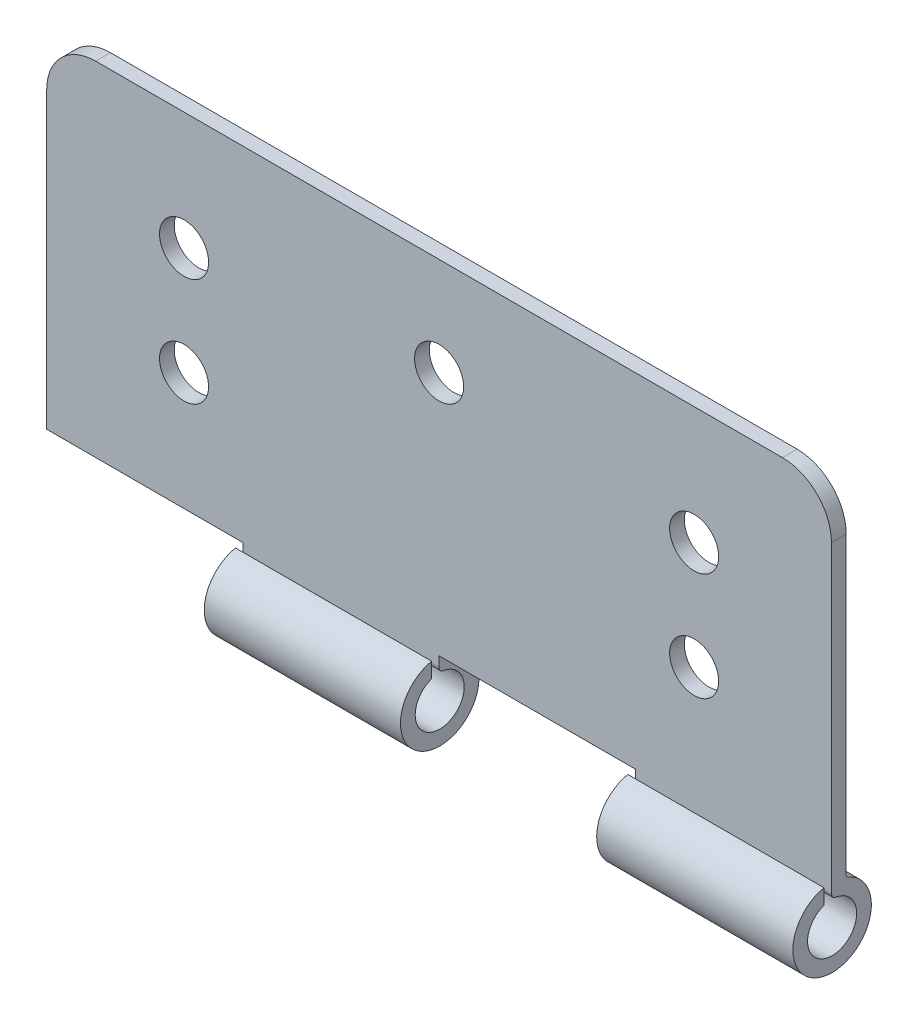
ISO-10303-21;
HEADER;
FILE_DESCRIPTION(('STEP AP214'),'2;1');
FILE_NAME('part.step','',(''),(''),'','','');
FILE_SCHEMA(('AUTOMOTIVE_DESIGN { 1 0 10303 214 1 1 1 1 }'));
ENDSEC;
DATA;
#1=APPLICATION_CONTEXT('core data for automotive mechanical design processes');
#2=APPLICATION_PROTOCOL_DEFINITION('international standard','automotive_design',2000,#1);
#3=PRODUCT_CONTEXT('',#1,'mechanical');
#4=PRODUCT('Part','Part','',(#3));
#5=PRODUCT_RELATED_PRODUCT_CATEGORY('part','',(#4));
#6=PRODUCT_DEFINITION_FORMATION('','',#4);
#7=PRODUCT_DEFINITION_CONTEXT('part definition',#1,'design');
#8=PRODUCT_DEFINITION('design','',#6,#7);
#9=PRODUCT_DEFINITION_SHAPE('','',#8);
#10=(LENGTH_UNIT() NAMED_UNIT(*) SI_UNIT(.MILLI.,.METRE.));
#11=(NAMED_UNIT(*) PLANE_ANGLE_UNIT() SI_UNIT($,.RADIAN.));
#12=(NAMED_UNIT(*) SI_UNIT($,.STERADIAN.) SOLID_ANGLE_UNIT());
#13=UNCERTAINTY_MEASURE_WITH_UNIT(LENGTH_MEASURE(1.E-05),#10,'distance_accuracy_value','');
#14=(GEOMETRIC_REPRESENTATION_CONTEXT(3) GLOBAL_UNCERTAINTY_ASSIGNED_CONTEXT((#13)) GLOBAL_UNIT_ASSIGNED_CONTEXT((#10,
#11,#12)) REPRESENTATION_CONTEXT('',''));
#15=CARTESIAN_POINT('',(0.,0.,0.));
#16=DIRECTION('',(0.,0.,1.));
#17=DIRECTION('',(1.,0.,0.));
#18=AXIS2_PLACEMENT_3D('',#15,#16,#17);
#19=CARTESIAN_POINT('',(40.,-17.5,1.5));
#20=DIRECTION('',(0.,1.,0.));
#21=DIRECTION('',(-1.,0.,0.));
#22=AXIS2_PLACEMENT_3D('',#19,#20,#21);
#23=PLANE('',#22);
#24=DIRECTION('',(0.,0.,1.));
#25=VECTOR('',#24,1.);
#26=CARTESIAN_POINT('',(-20.,-17.5,0.));
#27=LINE('',#26,#25);
#28=CARTESIAN_POINT('',(-20.,-17.5,0.));
#29=VERTEX_POINT('',#28);
#30=CARTESIAN_POINT('',(-20.,-17.5,1.5));
#31=VERTEX_POINT('',#30);
#32=EDGE_CURVE('E58',#29,#31,#27,.T.);
#33=ORIENTED_EDGE('',*,*,#32,.T.);
#34=DIRECTION('',(1.,0.,0.));
#35=VECTOR('',#34,1.);
#36=CARTESIAN_POINT('',(40.,-17.5,1.5));
#37=LINE('',#36,#35);
#38=CARTESIAN_POINT('',(-40.,-17.5,1.5));
#39=VERTEX_POINT('',#38);
#40=EDGE_CURVE('E311',#39,#31,#37,.T.);
#41=ORIENTED_EDGE('',*,*,#40,.F.);
#42=DIRECTION('',(0.,0.,-1.));
#43=VECTOR('',#42,1.);
#44=CARTESIAN_POINT('',(-40.,-17.5,1.5));
#45=LINE('',#44,#43);
#46=CARTESIAN_POINT('',(-40.,-17.5,0.));
#47=VERTEX_POINT('',#46);
#48=EDGE_CURVE('E313',#39,#47,#45,.T.);
#49=ORIENTED_EDGE('',*,*,#48,.T.);
#50=DIRECTION('',(1.,0.,0.));
#51=VECTOR('',#50,1.);
#52=CARTESIAN_POINT('',(40.,-17.5,0.));
#53=LINE('',#52,#51);
#54=EDGE_CURVE('E303',#47,#29,#53,.T.);
#55=ORIENTED_EDGE('',*,*,#54,.T.);
#56=EDGE_LOOP('',(#33,#41,#49,#55));
#57=FACE_BOUND('',#56,.T.);
#58=ADVANCED_FACE('F33',(#57),#23,.F.);
#59=CARTESIAN_POINT('',(40.,-17.5,1.5));
#60=DIRECTION('',(-1.,0.,0.));
#61=DIRECTION('',(0.,0.,1.));
#62=AXIS2_PLACEMENT_3D('',#59,#60,#61);
#63=PLANE('',#62);
#64=DIRECTION('',(0.,1.,0.));
#65=VECTOR('',#64,1.);
#66=CARTESIAN_POINT('',(40.,-17.5,0.));
#67=LINE('',#66,#65);
#68=CARTESIAN_POINT('',(40.,-17.5989471089014,0.));
#69=VERTEX_POINT('',#68);
#70=CARTESIAN_POINT('',(40.,12.5,0.));
#71=VERTEX_POINT('',#70);
#72=EDGE_CURVE('E288',#69,#71,#67,.T.);
#73=ORIENTED_EDGE('',*,*,#72,.T.);
#74=DIRECTION('',(0.,0.,-1.));
#75=VECTOR('',#74,1.);
#76=CARTESIAN_POINT('',(40.,12.5,1.5));
#77=LINE('',#76,#75);
#78=CARTESIAN_POINT('',(40.,12.5,1.5));
#79=VERTEX_POINT('',#78);
#80=EDGE_CURVE('E11',#79,#71,#77,.T.);
#81=ORIENTED_EDGE('',*,*,#80,.F.);
#82=DIRECTION('',(0.,1.,0.));
#83=VECTOR('',#82,1.);
#84=CARTESIAN_POINT('',(40.,-17.5,1.5));
#85=LINE('',#84,#83);
#86=CARTESIAN_POINT('',(40.,-18.5316046724608,1.5));
#87=VERTEX_POINT('',#86);
#88=EDGE_CURVE('E299',#87,#79,#85,.T.);
#89=ORIENTED_EDGE('',*,*,#88,.F.);
#90=CARTESIAN_POINT('',(40.,-18.5316046724608,1.));
#91=DIRECTION('',(1.,0.,0.));
#92=DIRECTION('',(0.,0.,-1.));
#93=AXIS2_PLACEMENT_3D('',#90,#91,#92);
#94=CIRCLE('',#93,0.5);
#95=CARTESIAN_POINT('',(40.,-19.0262561690371,1.07293762358944));
#96=VERTEX_POINT('',#95);
#97=EDGE_CURVE('E239',#87,#96,#94,.T.);
#98=ORIENTED_EDGE('',*,*,#97,.T.);
#99=CARTESIAN_POINT('',(40.,-21.4995136519183,1.43762574153661));
#100=DIRECTION('',(-1.,0.,0.));
#101=DIRECTION('',(0.,0.,-1.));
#102=AXIS2_PLACEMENT_3D('',#99,#100,#101);
#103=CIRCLE('',#102,2.5);
#104=CARTESIAN_POINT('',(40.,-19.1403349739834,2.2648354885641));
#105=VERTEX_POINT('',#104);
#106=EDGE_CURVE('E274',#96,#105,#103,.T.);
#107=ORIENTED_EDGE('',*,*,#106,.T.);
#108=DIRECTION('',(0.,1.,0.));
#109=VECTOR('',#108,1.);
#110=CARTESIAN_POINT('',(40.,-17.585982760968,2.2648354885641));
#111=LINE('',#110,#109);
#112=CARTESIAN_POINT('',(40.,-17.585982760968,2.2648354885641));
#113=VERTEX_POINT('',#112);
#114=EDGE_CURVE('E277',#105,#113,#111,.T.);
#115=ORIENTED_EDGE('',*,*,#114,.T.);
#116=CARTESIAN_POINT('',(40.,-21.4995136519183,1.43762574153661));
#117=DIRECTION('',(1.,0.,0.));
#118=DIRECTION('',(0.,0.,-1.));
#119=AXIS2_PLACEMENT_3D('',#116,#117,#118);
#120=CIRCLE('',#119,4.);
#121=CARTESIAN_POINT('',(40.,-17.8283921996671,-0.15072789755667));
#122=VERTEX_POINT('',#121);
#123=EDGE_CURVE('E280',#113,#122,#120,.T.);
#124=ORIENTED_EDGE('',*,*,#123,.T.);
#125=CARTESIAN_POINT('',(40.,-17.5989471089014,-0.25));
#126=DIRECTION('',(-1.,0.,0.));
#127=DIRECTION('',(0.,0.,-1.));
#128=AXIS2_PLACEMENT_3D('',#125,#126,#127);
#129=CIRCLE('',#128,0.25);
#130=EDGE_CURVE('E251',#122,#69,#129,.T.);
#131=ORIENTED_EDGE('',*,*,#130,.T.);
#132=EDGE_LOOP('',(#73,#81,#89,#98,#107,#115,#124,#131));
#133=FACE_BOUND('',#132,.T.);
#134=ADVANCED_FACE('F35',(#133),#63,.F.);
#135=CARTESIAN_POINT('',(35.,12.5,1.5));
#136=DIRECTION('',(0.,0.,-1.));
#137=DIRECTION('',(-1.,0.,0.));
#138=AXIS2_PLACEMENT_3D('',#135,#136,#137);
#139=CYLINDRICAL_SURFACE('',#138,5.);
#140=CARTESIAN_POINT('',(35.,12.5,0.));
#141=DIRECTION('',(0.,0.,1.));
#142=DIRECTION('',(1.,0.,0.));
#143=AXIS2_PLACEMENT_3D('',#140,#141,#142);
#144=CIRCLE('',#143,5.);
#145=CARTESIAN_POINT('',(35.,17.5,0.));
#146=VERTEX_POINT('',#145);
#147=EDGE_CURVE('E316',#71,#146,#144,.T.);
#148=ORIENTED_EDGE('',*,*,#147,.T.);
#149=DIRECTION('',(0.,0.,-1.));
#150=VECTOR('',#149,1.);
#151=CARTESIAN_POINT('',(35.,17.5,1.5));
#152=LINE('',#151,#150);
#153=CARTESIAN_POINT('',(35.,17.5,1.5));
#154=VERTEX_POINT('',#153);
#155=EDGE_CURVE('E42',#154,#146,#152,.T.);
#156=ORIENTED_EDGE('',*,*,#155,.F.);
#157=CARTESIAN_POINT('',(35.,12.5,1.5));
#158=DIRECTION('',(0.,0.,1.));
#159=DIRECTION('',(1.,0.,0.));
#160=AXIS2_PLACEMENT_3D('',#157,#158,#159);
#161=CIRCLE('',#160,5.);
#162=EDGE_CURVE('E302',#79,#154,#161,.T.);
#163=ORIENTED_EDGE('',*,*,#162,.F.);
#164=ORIENTED_EDGE('',*,*,#80,.T.);
#165=EDGE_LOOP('',(#148,#156,#163,#164));
#166=FACE_BOUND('',#165,.T.);
#167=ADVANCED_FACE('F382',(#166),#139,.T.);
#168=CARTESIAN_POINT('',(35.,17.5,1.5));
#169=DIRECTION('',(0.,-1.,0.));
#170=DIRECTION('',(1.,0.,0.));
#171=AXIS2_PLACEMENT_3D('',#168,#169,#170);
#172=PLANE('',#171);
#173=DIRECTION('',(-1.,0.,0.));
#174=VECTOR('',#173,1.);
#175=CARTESIAN_POINT('',(35.,17.5,0.));
#176=LINE('',#175,#174);
#177=CARTESIAN_POINT('',(-35.,17.5,0.));
#178=VERTEX_POINT('',#177);
#179=EDGE_CURVE('E318',#146,#178,#176,.T.);
#180=ORIENTED_EDGE('',*,*,#179,.T.);
#181=DIRECTION('',(0.,0.,-1.));
#182=VECTOR('',#181,1.);
#183=CARTESIAN_POINT('',(-35.,17.5,1.5));
#184=LINE('',#183,#182);
#185=CARTESIAN_POINT('',(-35.,17.5,1.5));
#186=VERTEX_POINT('',#185);
#187=EDGE_CURVE('E331',#186,#178,#184,.T.);
#188=ORIENTED_EDGE('',*,*,#187,.F.);
#189=DIRECTION('',(-1.,0.,0.));
#190=VECTOR('',#189,1.);
#191=CARTESIAN_POINT('',(35.,17.5,1.5));
#192=LINE('',#191,#190);
#193=EDGE_CURVE('E305',#154,#186,#192,.T.);
#194=ORIENTED_EDGE('',*,*,#193,.F.);
#195=ORIENTED_EDGE('',*,*,#155,.T.);
#196=EDGE_LOOP('',(#180,#188,#194,#195));
#197=FACE_BOUND('',#196,.T.);
#198=ADVANCED_FACE('F387',(#197),#172,.F.);
#199=CARTESIAN_POINT('',(-35.,12.5,1.5));
#200=DIRECTION('',(0.,0.,-1.));
#201=DIRECTION('',(-1.,0.,0.));
#202=AXIS2_PLACEMENT_3D('',#199,#200,#201);
#203=CYLINDRICAL_SURFACE('',#202,5.);
#204=CARTESIAN_POINT('',(-35.,12.5,0.));
#205=DIRECTION('',(0.,0.,1.));
#206=DIRECTION('',(1.,0.,0.));
#207=AXIS2_PLACEMENT_3D('',#204,#205,#206);
#208=CIRCLE('',#207,5.);
#209=CARTESIAN_POINT('',(-40.,12.5,0.));
#210=VERTEX_POINT('',#209);
#211=EDGE_CURVE('E320',#178,#210,#208,.T.);
#212=ORIENTED_EDGE('',*,*,#211,.T.);
#213=DIRECTION('',(0.,0.,-1.));
#214=VECTOR('',#213,1.);
#215=CARTESIAN_POINT('',(-40.,12.5,1.5));
#216=LINE('',#215,#214);
#217=CARTESIAN_POINT('',(-40.,12.5,1.5));
#218=VERTEX_POINT('',#217);
#219=EDGE_CURVE('E328',#218,#210,#216,.T.);
#220=ORIENTED_EDGE('',*,*,#219,.F.);
#221=CARTESIAN_POINT('',(-35.,12.5,1.5));
#222=DIRECTION('',(0.,0.,1.));
#223=DIRECTION('',(1.,0.,0.));
#224=AXIS2_PLACEMENT_3D('',#221,#222,#223);
#225=CIRCLE('',#224,5.);
#226=EDGE_CURVE('E307',#186,#218,#225,.T.);
#227=ORIENTED_EDGE('',*,*,#226,.F.);
#228=ORIENTED_EDGE('',*,*,#187,.T.);
#229=EDGE_LOOP('',(#212,#220,#227,#228));
#230=FACE_BOUND('',#229,.T.);
#231=ADVANCED_FACE('F393',(#230),#203,.T.);
#232=CARTESIAN_POINT('',(-40.,-17.5,1.5));
#233=DIRECTION('',(1.,0.,0.));
#234=DIRECTION('',(0.,0.,-1.));
#235=AXIS2_PLACEMENT_3D('',#232,#233,#234);
#236=PLANE('',#235);
#237=DIRECTION('',(0.,-1.,0.));
#238=VECTOR('',#237,1.);
#239=CARTESIAN_POINT('',(-40.,-17.5,0.));
#240=LINE('',#239,#238);
#241=EDGE_CURVE('E322',#210,#47,#240,.T.);
#242=ORIENTED_EDGE('',*,*,#241,.T.);
#243=ORIENTED_EDGE('',*,*,#48,.F.);
#244=DIRECTION('',(0.,-1.,0.));
#245=VECTOR('',#244,1.);
#246=CARTESIAN_POINT('',(-40.,-17.5,1.5));
#247=LINE('',#246,#245);
#248=EDGE_CURVE('E309',#218,#39,#247,.T.);
#249=ORIENTED_EDGE('',*,*,#248,.F.);
#250=ORIENTED_EDGE('',*,*,#219,.T.);
#251=EDGE_LOOP('',(#242,#243,#249,#250));
#252=FACE_BOUND('',#251,.T.);
#253=ADVANCED_FACE('F397',(#252),#236,.F.);
#254=CARTESIAN_POINT('',(0.,-17.5,1.5));
#255=VERTEX_POINT('',#254);
#256=CARTESIAN_POINT('',(20.,-17.5,1.5));
#257=VERTEX_POINT('',#256);
#258=EDGE_CURVE('E50',#255,#257,#37,.T.);
#259=ORIENTED_EDGE('',*,*,#258,.F.);
#260=DIRECTION('',(0.,0.,1.));
#261=VECTOR('',#260,1.);
#262=CARTESIAN_POINT('',(0.,-17.5,0.));
#263=LINE('',#262,#261);
#264=CARTESIAN_POINT('',(0.,-17.5,0.));
#265=VERTEX_POINT('',#264);
#266=EDGE_CURVE('E203',#265,#255,#263,.T.);
#267=ORIENTED_EDGE('',*,*,#266,.F.);
#268=CARTESIAN_POINT('',(20.,-17.5,0.));
#269=VERTEX_POINT('',#268);
#270=EDGE_CURVE('E324',#265,#269,#53,.T.);
#271=ORIENTED_EDGE('',*,*,#270,.T.);
#272=DIRECTION('',(0.,0.,1.));
#273=VECTOR('',#272,1.);
#274=CARTESIAN_POINT('',(20.,-17.5,0.));
#275=LINE('',#274,#273);
#276=EDGE_CURVE('E266',#269,#257,#275,.T.);
#277=ORIENTED_EDGE('',*,*,#276,.T.);
#278=EDGE_LOOP('',(#259,#267,#271,#277));
#279=FACE_BOUND('',#278,.T.);
#280=ADVANCED_FACE('F369',(#279),#23,.F.);
#281=CARTESIAN_POINT('',(35.,12.5,1.5));
#282=DIRECTION('',(0.,0.,1.));
#283=DIRECTION('',(1.,0.,0.));
#284=AXIS2_PLACEMENT_3D('',#281,#282,#283);
#285=PLANE('',#284);
#286=CARTESIAN_POINT('',(26.,5.5,1.5));
#287=DIRECTION('',(0.,0.,1.));
#288=DIRECTION('',(1.,0.,0.));
#289=AXIS2_PLACEMENT_3D('',#286,#287,#288);
#290=CIRCLE('',#289,2.5);
#291=CARTESIAN_POINT('',(28.5,5.5,1.5));
#292=VERTEX_POINT('',#291);
#293=EDGE_CURVE('E356',#292,#292,#290,.T.);
#294=ORIENTED_EDGE('',*,*,#293,.F.);
#295=EDGE_LOOP('',(#294));
#296=FACE_BOUND('',#295,.T.);
#297=CARTESIAN_POINT('',(-26.,5.5,1.5));
#298=DIRECTION('',(0.,0.,1.));
#299=DIRECTION('',(1.,0.,0.));
#300=AXIS2_PLACEMENT_3D('',#297,#298,#299);
#301=CIRCLE('',#300,2.5);
#302=CARTESIAN_POINT('',(-23.5,5.5,1.5));
#303=VERTEX_POINT('',#302);
#304=EDGE_CURVE('E347',#303,#303,#301,.T.);
#305=ORIENTED_EDGE('',*,*,#304,.F.);
#306=EDGE_LOOP('',(#305));
#307=FACE_BOUND('',#306,.T.);
#308=CARTESIAN_POINT('',(-26.,-5.50000000000002,1.5));
#309=DIRECTION('',(0.,0.,1.));
#310=DIRECTION('',(1.,0.,0.));
#311=AXIS2_PLACEMENT_3D('',#308,#309,#310);
#312=CIRCLE('',#311,2.5);
#313=CARTESIAN_POINT('',(-23.5,-5.50000000000002,1.5));
#314=VERTEX_POINT('',#313);
#315=EDGE_CURVE('E342',#314,#314,#312,.T.);
#316=ORIENTED_EDGE('',*,*,#315,.F.);
#317=EDGE_LOOP('',(#316));
#318=FACE_BOUND('',#317,.T.);
#319=CARTESIAN_POINT('',(26.,-5.50000000000001,1.5));
#320=DIRECTION('',(0.,0.,1.));
#321=DIRECTION('',(1.,0.,0.));
#322=AXIS2_PLACEMENT_3D('',#319,#320,#321);
#323=CIRCLE('',#322,2.5);
#324=CARTESIAN_POINT('',(28.5,-5.50000000000001,1.5));
#325=VERTEX_POINT('',#324);
#326=EDGE_CURVE('E346',#325,#325,#323,.T.);
#327=ORIENTED_EDGE('',*,*,#326,.F.);
#328=EDGE_LOOP('',(#327));
#329=FACE_BOUND('',#328,.T.);
#330=CARTESIAN_POINT('',(0.,7.5,1.5));
#331=DIRECTION('',(0.,0.,1.));
#332=DIRECTION('',(1.,0.,0.));
#333=AXIS2_PLACEMENT_3D('',#330,#331,#332);
#334=CIRCLE('',#333,2.5);
#335=CARTESIAN_POINT('',(2.5,7.5,1.5));
#336=VERTEX_POINT('',#335);
#337=EDGE_CURVE('E206',#336,#336,#334,.T.);
#338=ORIENTED_EDGE('',*,*,#337,.F.);
#339=EDGE_LOOP('',(#338));
#340=FACE_BOUND('',#339,.T.);
#341=ORIENTED_EDGE('',*,*,#88,.T.);
#342=ORIENTED_EDGE('',*,*,#162,.T.);
#343=ORIENTED_EDGE('',*,*,#193,.T.);
#344=ORIENTED_EDGE('',*,*,#226,.T.);
#345=ORIENTED_EDGE('',*,*,#248,.T.);
#346=ORIENTED_EDGE('',*,*,#40,.T.);
#347=DIRECTION('',(0.,-1.,0.));
#348=VECTOR('',#347,1.);
#349=CARTESIAN_POINT('',(-20.,-17.5,1.5));
#350=LINE('',#349,#348);
#351=CARTESIAN_POINT('',(-20.,-18.5316046724608,1.5));
#352=VERTEX_POINT('',#351);
#353=EDGE_CURVE('E185',#31,#352,#350,.T.);
#354=ORIENTED_EDGE('',*,*,#353,.T.);
#355=DIRECTION('',(1.,0.,0.));
#356=VECTOR('',#355,1.);
#357=CARTESIAN_POINT('',(-20.,-18.5316046724608,1.5));
#358=LINE('',#357,#356);
#359=CARTESIAN_POINT('',(0.,-18.5316046724608,1.5));
#360=VERTEX_POINT('',#359);
#361=EDGE_CURVE('E199',#352,#360,#358,.T.);
#362=ORIENTED_EDGE('',*,*,#361,.T.);
#363=DIRECTION('',(0.,-1.,0.));
#364=VECTOR('',#363,1.);
#365=CARTESIAN_POINT('',(0.,-17.5,1.5));
#366=LINE('',#365,#364);
#367=EDGE_CURVE('E200',#255,#360,#366,.T.);
#368=ORIENTED_EDGE('',*,*,#367,.F.);
#369=ORIENTED_EDGE('',*,*,#258,.T.);
#370=DIRECTION('',(0.,-1.,0.));
#371=VECTOR('',#370,1.);
#372=CARTESIAN_POINT('',(20.,-17.5,1.5));
#373=LINE('',#372,#371);
#374=CARTESIAN_POINT('',(20.,-18.5316046724608,1.5));
#375=VERTEX_POINT('',#374);
#376=EDGE_CURVE('E268',#257,#375,#373,.T.);
#377=ORIENTED_EDGE('',*,*,#376,.T.);
#378=DIRECTION('',(1.,0.,0.));
#379=VECTOR('',#378,1.);
#380=CARTESIAN_POINT('',(20.,-18.5316046724608,1.5));
#381=LINE('',#380,#379);
#382=EDGE_CURVE('E285',#375,#87,#381,.T.);
#383=ORIENTED_EDGE('',*,*,#382,.T.);
#384=EDGE_LOOP('',(#341,#342,#343,#344,#345,#346,#354,#362,#368,#369,#377,#383));
#385=FACE_BOUND('',#384,.T.);
#386=ADVANCED_FACE('F365',(#296,#307,#318,#329,#340,#385),#285,.T.);
#387=CARTESIAN_POINT('',(35.,12.5,0.));
#388=DIRECTION('',(0.,0.,1.));
#389=DIRECTION('',(1.,0.,0.));
#390=AXIS2_PLACEMENT_3D('',#387,#388,#389);
#391=PLANE('',#390);
#392=CARTESIAN_POINT('',(26.,5.5,0.));
#393=DIRECTION('',(0.,0.,1.));
#394=DIRECTION('',(1.,0.,0.));
#395=AXIS2_PLACEMENT_3D('',#392,#393,#394);
#396=CIRCLE('',#395,2.5);
#397=CARTESIAN_POINT('',(28.5,5.5,0.));
#398=VERTEX_POINT('',#397);
#399=EDGE_CURVE('E37',#398,#398,#396,.T.);
#400=ORIENTED_EDGE('',*,*,#399,.T.);
#401=EDGE_LOOP('',(#400));
#402=FACE_BOUND('',#401,.T.);
#403=CARTESIAN_POINT('',(-26.,5.5,0.));
#404=DIRECTION('',(0.,0.,1.));
#405=DIRECTION('',(1.,0.,0.));
#406=AXIS2_PLACEMENT_3D('',#403,#404,#405);
#407=CIRCLE('',#406,2.5);
#408=CARTESIAN_POINT('',(-23.5,5.5,0.));
#409=VERTEX_POINT('',#408);
#410=EDGE_CURVE('E344',#409,#409,#407,.T.);
#411=ORIENTED_EDGE('',*,*,#410,.T.);
#412=EDGE_LOOP('',(#411));
#413=FACE_BOUND('',#412,.T.);
#414=CARTESIAN_POINT('',(-26.,-5.50000000000002,0.));
#415=DIRECTION('',(0.,0.,1.));
#416=DIRECTION('',(1.,0.,0.));
#417=AXIS2_PLACEMENT_3D('',#414,#415,#416);
#418=CIRCLE('',#417,2.5);
#419=CARTESIAN_POINT('',(-23.5,-5.50000000000002,0.));
#420=VERTEX_POINT('',#419);
#421=EDGE_CURVE('E341',#420,#420,#418,.T.);
#422=ORIENTED_EDGE('',*,*,#421,.T.);
#423=EDGE_LOOP('',(#422));
#424=FACE_BOUND('',#423,.T.);
#425=CARTESIAN_POINT('',(26.,-5.50000000000001,0.));
#426=DIRECTION('',(0.,0.,1.));
#427=DIRECTION('',(1.,0.,0.));
#428=AXIS2_PLACEMENT_3D('',#425,#426,#427);
#429=CIRCLE('',#428,2.5);
#430=CARTESIAN_POINT('',(28.5,-5.50000000000001,0.));
#431=VERTEX_POINT('',#430);
#432=EDGE_CURVE('E338',#431,#431,#429,.T.);
#433=ORIENTED_EDGE('',*,*,#432,.T.);
#434=EDGE_LOOP('',(#433));
#435=FACE_BOUND('',#434,.T.);
#436=CARTESIAN_POINT('',(0.,7.5,0.));
#437=DIRECTION('',(0.,0.,1.));
#438=DIRECTION('',(1.,0.,0.));
#439=AXIS2_PLACEMENT_3D('',#436,#437,#438);
#440=CIRCLE('',#439,2.5);
#441=CARTESIAN_POINT('',(2.5,7.5,0.));
#442=VERTEX_POINT('',#441);
#443=EDGE_CURVE('E223',#442,#442,#440,.T.);
#444=ORIENTED_EDGE('',*,*,#443,.T.);
#445=EDGE_LOOP('',(#444));
#446=FACE_BOUND('',#445,.T.);
#447=ORIENTED_EDGE('',*,*,#72,.F.);
#448=DIRECTION('',(1.,0.,0.));
#449=VECTOR('',#448,1.);
#450=CARTESIAN_POINT('',(20.,-17.5989471089014,0.));
#451=LINE('',#450,#449);
#452=CARTESIAN_POINT('',(20.,-17.5989471089014,0.));
#453=VERTEX_POINT('',#452);
#454=EDGE_CURVE('E289',#453,#69,#451,.T.);
#455=ORIENTED_EDGE('',*,*,#454,.F.);
#456=DIRECTION('',(0.,1.,0.));
#457=VECTOR('',#456,1.);
#458=CARTESIAN_POINT('',(20.,-17.5,0.));
#459=LINE('',#458,#457);
#460=EDGE_CURVE('E263',#453,#269,#459,.T.);
#461=ORIENTED_EDGE('',*,*,#460,.T.);
#462=ORIENTED_EDGE('',*,*,#270,.F.);
#463=DIRECTION('',(0.,1.,0.));
#464=VECTOR('',#463,1.);
#465=CARTESIAN_POINT('',(0.,-17.5,0.));
#466=LINE('',#465,#464);
#467=CARTESIAN_POINT('',(0.,-17.5989471089014,0.));
#468=VERTEX_POINT('',#467);
#469=EDGE_CURVE('E234',#468,#265,#466,.T.);
#470=ORIENTED_EDGE('',*,*,#469,.F.);
#471=DIRECTION('',(1.,0.,0.));
#472=VECTOR('',#471,1.);
#473=CARTESIAN_POINT('',(-20.,-17.5989471089014,0.));
#474=LINE('',#473,#472);
#475=CARTESIAN_POINT('',(-20.,-17.5989471089014,0.));
#476=VERTEX_POINT('',#475);
#477=EDGE_CURVE('E240',#476,#468,#474,.T.);
#478=ORIENTED_EDGE('',*,*,#477,.F.);
#479=DIRECTION('',(0.,1.,0.));
#480=VECTOR('',#479,1.);
#481=CARTESIAN_POINT('',(-20.,-17.5,0.));
#482=LINE('',#481,#480);
#483=EDGE_CURVE('E216',#476,#29,#482,.T.);
#484=ORIENTED_EDGE('',*,*,#483,.T.);
#485=ORIENTED_EDGE('',*,*,#54,.F.);
#486=ORIENTED_EDGE('',*,*,#241,.F.);
#487=ORIENTED_EDGE('',*,*,#211,.F.);
#488=ORIENTED_EDGE('',*,*,#179,.F.);
#489=ORIENTED_EDGE('',*,*,#147,.F.);
#490=EDGE_LOOP('',(#447,#455,#461,#462,#470,#478,#484,#485,#486,#487,#488,#489));
#491=FACE_BOUND('',#490,.T.);
#492=ADVANCED_FACE('F368',(#402,#413,#424,#435,#446,#491),#391,.F.);
#493=CARTESIAN_POINT('',(20.,-18.5316046724608,1.));
#494=DIRECTION('',(1.,0.,0.));
#495=DIRECTION('',(0.,0.,-1.));
#496=AXIS2_PLACEMENT_3D('',#493,#494,#495);
#497=CYLINDRICAL_SURFACE('',#496,0.5);
#498=ORIENTED_EDGE('',*,*,#97,.F.);
#499=ORIENTED_EDGE('',*,*,#382,.F.);
#500=CARTESIAN_POINT('',(20.,-18.5316046724608,1.));
#501=DIRECTION('',(1.,0.,0.));
#502=DIRECTION('',(0.,0.,-1.));
#503=AXIS2_PLACEMENT_3D('',#500,#501,#502);
#504=CIRCLE('',#503,0.5);
#505=CARTESIAN_POINT('',(20.,-19.0262561690371,1.07293762358944));
#506=VERTEX_POINT('',#505);
#507=EDGE_CURVE('E247',#375,#506,#504,.T.);
#508=ORIENTED_EDGE('',*,*,#507,.T.);
#509=DIRECTION('',(1.,0.,0.));
#510=VECTOR('',#509,1.);
#511=CARTESIAN_POINT('',(20.,-19.0262561690371,1.07293762358944));
#512=LINE('',#511,#510);
#513=EDGE_CURVE('E271',#506,#96,#512,.T.);
#514=ORIENTED_EDGE('',*,*,#513,.T.);
#515=EDGE_LOOP('',(#498,#499,#508,#514));
#516=FACE_BOUND('',#515,.T.);
#517=ADVANCED_FACE('F438',(#516),#497,.T.);
#518=CARTESIAN_POINT('',(20.,-17.5989471089014,-0.25));
#519=DIRECTION('',(1.,0.,0.));
#520=DIRECTION('',(0.,0.,-1.));
#521=AXIS2_PLACEMENT_3D('',#518,#519,#520);
#522=CYLINDRICAL_SURFACE('',#521,0.25);
#523=ORIENTED_EDGE('',*,*,#130,.F.);
#524=DIRECTION('',(1.,0.,0.));
#525=VECTOR('',#524,1.);
#526=CARTESIAN_POINT('',(20.,-17.8283921996671,-0.15072789755667));
#527=LINE('',#526,#525);
#528=CARTESIAN_POINT('',(20.,-17.8283921996671,-0.15072789755667));
#529=VERTEX_POINT('',#528);
#530=EDGE_CURVE('E292',#529,#122,#527,.T.);
#531=ORIENTED_EDGE('',*,*,#530,.F.);
#532=CARTESIAN_POINT('',(20.,-17.5989471089014,-0.25));
#533=DIRECTION('',(-1.,0.,0.));
#534=DIRECTION('',(0.,0.,-1.));
#535=AXIS2_PLACEMENT_3D('',#532,#533,#534);
#536=CIRCLE('',#535,0.25);
#537=EDGE_CURVE('E260',#529,#453,#536,.T.);
#538=ORIENTED_EDGE('',*,*,#537,.T.);
#539=ORIENTED_EDGE('',*,*,#454,.T.);
#540=EDGE_LOOP('',(#523,#531,#538,#539));
#541=FACE_BOUND('',#540,.T.);
#542=ADVANCED_FACE('F426',(#541),#522,.F.);
#543=CARTESIAN_POINT('',(20.,-21.4995136519183,1.43762574153661));
#544=DIRECTION('',(1.,0.,0.));
#545=DIRECTION('',(0.,0.,-1.));
#546=AXIS2_PLACEMENT_3D('',#543,#544,#545);
#547=CYLINDRICAL_SURFACE('',#546,4.);
#548=ORIENTED_EDGE('',*,*,#123,.F.);
#549=DIRECTION('',(1.,0.,0.));
#550=VECTOR('',#549,1.);
#551=CARTESIAN_POINT('',(20.,-17.585982760968,2.2648354885641));
#552=LINE('',#551,#550);
#553=CARTESIAN_POINT('',(20.,-17.585982760968,2.2648354885641));
#554=VERTEX_POINT('',#553);
#555=EDGE_CURVE('E294',#554,#113,#552,.T.);
#556=ORIENTED_EDGE('',*,*,#555,.F.);
#557=CARTESIAN_POINT('',(20.,-21.4995136519183,1.43762574153661));
#558=DIRECTION('',(1.,0.,0.));
#559=DIRECTION('',(0.,0.,-1.));
#560=AXIS2_PLACEMENT_3D('',#557,#558,#559);
#561=CIRCLE('',#560,4.);
#562=EDGE_CURVE('E257',#554,#529,#561,.T.);
#563=ORIENTED_EDGE('',*,*,#562,.T.);
#564=ORIENTED_EDGE('',*,*,#530,.T.);
#565=EDGE_LOOP('',(#548,#556,#563,#564));
#566=FACE_BOUND('',#565,.T.);
#567=ADVANCED_FACE('F429',(#566),#547,.T.);
#568=CARTESIAN_POINT('',(20.,-17.585982760968,2.2648354885641));
#569=DIRECTION('',(0.,0.,-1.));
#570=DIRECTION('',(-1.,0.,0.));
#571=AXIS2_PLACEMENT_3D('',#568,#569,#570);
#572=PLANE('',#571);
#573=ORIENTED_EDGE('',*,*,#114,.F.);
#574=DIRECTION('',(1.,0.,0.));
#575=VECTOR('',#574,1.);
#576=CARTESIAN_POINT('',(20.,-19.1403349739834,2.2648354885641));
#577=LINE('',#576,#575);
#578=CARTESIAN_POINT('',(20.,-19.1403349739834,2.2648354885641));
#579=VERTEX_POINT('',#578);
#580=EDGE_CURVE('E296',#579,#105,#577,.T.);
#581=ORIENTED_EDGE('',*,*,#580,.F.);
#582=DIRECTION('',(0.,1.,0.));
#583=VECTOR('',#582,1.);
#584=CARTESIAN_POINT('',(20.,-17.585982760968,2.2648354885641));
#585=LINE('',#584,#583);
#586=EDGE_CURVE('E254',#579,#554,#585,.T.);
#587=ORIENTED_EDGE('',*,*,#586,.T.);
#588=ORIENTED_EDGE('',*,*,#555,.T.);
#589=EDGE_LOOP('',(#573,#581,#587,#588));
#590=FACE_BOUND('',#589,.T.);
#591=ADVANCED_FACE('F433',(#590),#572,.T.);
#592=CARTESIAN_POINT('',(20.,-21.4995136519183,1.43762574153661));
#593=DIRECTION('',(1.,0.,0.));
#594=DIRECTION('',(0.,0.,-1.));
#595=AXIS2_PLACEMENT_3D('',#592,#593,#594);
#596=CYLINDRICAL_SURFACE('',#595,2.5);
#597=ORIENTED_EDGE('',*,*,#106,.F.);
#598=ORIENTED_EDGE('',*,*,#513,.F.);
#599=CARTESIAN_POINT('',(20.,-21.4995136519183,1.43762574153661));
#600=DIRECTION('',(-1.,0.,0.));
#601=DIRECTION('',(0.,0.,-1.));
#602=AXIS2_PLACEMENT_3D('',#599,#600,#601);
#603=CIRCLE('',#602,2.5);
#604=EDGE_CURVE('E250',#506,#579,#603,.T.);
#605=ORIENTED_EDGE('',*,*,#604,.T.);
#606=ORIENTED_EDGE('',*,*,#580,.T.);
#607=EDGE_LOOP('',(#597,#598,#605,#606));
#608=FACE_BOUND('',#607,.T.);
#609=ADVANCED_FACE('F436',(#608),#596,.F.);
#610=CARTESIAN_POINT('',(20.,-18.5316046724608,1.));
#611=DIRECTION('',(1.,0.,0.));
#612=DIRECTION('',(0.,0.,-1.));
#613=AXIS2_PLACEMENT_3D('',#610,#611,#612);
#614=PLANE('',#613);
#615=ORIENTED_EDGE('',*,*,#507,.F.);
#616=ORIENTED_EDGE('',*,*,#376,.F.);
#617=ORIENTED_EDGE('',*,*,#276,.F.);
#618=ORIENTED_EDGE('',*,*,#460,.F.);
#619=ORIENTED_EDGE('',*,*,#537,.F.);
#620=ORIENTED_EDGE('',*,*,#562,.F.);
#621=ORIENTED_EDGE('',*,*,#586,.F.);
#622=ORIENTED_EDGE('',*,*,#604,.F.);
#623=EDGE_LOOP('',(#615,#616,#617,#618,#619,#620,#621,#622));
#624=FACE_BOUND('',#623,.T.);
#625=ADVANCED_FACE('F419',(#624),#614,.F.);
#626=CARTESIAN_POINT('',(-20.,-18.5316046724608,1.));
#627=DIRECTION('',(1.,0.,0.));
#628=DIRECTION('',(0.,0.,-1.));
#629=AXIS2_PLACEMENT_3D('',#626,#627,#628);
#630=CYLINDRICAL_SURFACE('',#629,0.5);
#631=CARTESIAN_POINT('',(0.,-18.5316046724608,1.));
#632=DIRECTION('',(1.,0.,0.));
#633=DIRECTION('',(0.,0.,-1.));
#634=AXIS2_PLACEMENT_3D('',#631,#632,#633);
#635=CIRCLE('',#634,0.5);
#636=CARTESIAN_POINT('',(0.,-19.0262561690371,1.07293762358944));
#637=VERTEX_POINT('',#636);
#638=EDGE_CURVE('E221',#360,#637,#635,.T.);
#639=ORIENTED_EDGE('',*,*,#638,.F.);
#640=ORIENTED_EDGE('',*,*,#361,.F.);
#641=CARTESIAN_POINT('',(-20.,-18.5316046724608,1.));
#642=DIRECTION('',(1.,0.,0.));
#643=DIRECTION('',(0.,0.,-1.));
#644=AXIS2_PLACEMENT_3D('',#641,#642,#643);
#645=CIRCLE('',#644,0.5);
#646=CARTESIAN_POINT('',(-20.,-19.0262561690371,1.07293762358944));
#647=VERTEX_POINT('',#646);
#648=EDGE_CURVE('E192',#352,#647,#645,.T.);
#649=ORIENTED_EDGE('',*,*,#648,.T.);
#650=DIRECTION('',(1.,0.,0.));
#651=VECTOR('',#650,1.);
#652=CARTESIAN_POINT('',(-20.,-19.0262561690371,1.07293762358944));
#653=LINE('',#652,#651);
#654=EDGE_CURVE('E174',#647,#637,#653,.T.);
#655=ORIENTED_EDGE('',*,*,#654,.T.);
#656=EDGE_LOOP('',(#639,#640,#649,#655));
#657=FACE_BOUND('',#656,.T.);
#658=ADVANCED_FACE('F198',(#657),#630,.T.);
#659=CARTESIAN_POINT('',(-20.,-17.5989471089014,-0.25));
#660=DIRECTION('',(1.,0.,0.));
#661=DIRECTION('',(0.,0.,-1.));
#662=AXIS2_PLACEMENT_3D('',#659,#660,#661);
#663=CYLINDRICAL_SURFACE('',#662,0.25);
#664=CARTESIAN_POINT('',(0.,-17.5989471089014,-0.25));
#665=DIRECTION('',(-1.,0.,0.));
#666=DIRECTION('',(0.,0.,-1.));
#667=AXIS2_PLACEMENT_3D('',#664,#665,#666);
#668=CIRCLE('',#667,0.25);
#669=CARTESIAN_POINT('',(0.,-17.8283921996671,-0.15072789755667));
#670=VERTEX_POINT('',#669);
#671=EDGE_CURVE('E231',#670,#468,#668,.T.);
#672=ORIENTED_EDGE('',*,*,#671,.F.);
#673=DIRECTION('',(1.,0.,0.));
#674=VECTOR('',#673,1.);
#675=CARTESIAN_POINT('',(-20.,-17.8283921996671,-0.15072789755667));
#676=LINE('',#675,#674);
#677=CARTESIAN_POINT('',(-20.,-17.8283921996671,-0.15072789755667));
#678=VERTEX_POINT('',#677);
#679=EDGE_CURVE('E242',#678,#670,#676,.T.);
#680=ORIENTED_EDGE('',*,*,#679,.F.);
#681=CARTESIAN_POINT('',(-20.,-17.5989471089014,-0.25));
#682=DIRECTION('',(-1.,0.,0.));
#683=DIRECTION('',(0.,0.,-1.));
#684=AXIS2_PLACEMENT_3D('',#681,#682,#683);
#685=CIRCLE('',#684,0.25);
#686=EDGE_CURVE('E213',#678,#476,#685,.T.);
#687=ORIENTED_EDGE('',*,*,#686,.T.);
#688=ORIENTED_EDGE('',*,*,#477,.T.);
#689=EDGE_LOOP('',(#672,#680,#687,#688));
#690=FACE_BOUND('',#689,.T.);
#691=ADVANCED_FACE('F405',(#690),#663,.F.);
#692=CARTESIAN_POINT('',(-20.,-21.4995136519183,1.43762574153661));
#693=DIRECTION('',(1.,0.,0.));
#694=DIRECTION('',(0.,0.,-1.));
#695=AXIS2_PLACEMENT_3D('',#692,#693,#694);
#696=CYLINDRICAL_SURFACE('',#695,4.);
#697=CARTESIAN_POINT('',(0.,-21.4995136519183,1.43762574153661));
#698=DIRECTION('',(1.,0.,0.));
#699=DIRECTION('',(0.,0.,-1.));
#700=AXIS2_PLACEMENT_3D('',#697,#698,#699);
#701=CIRCLE('',#700,4.);
#702=CARTESIAN_POINT('',(0.,-17.585982760968,2.2648354885641));
#703=VERTEX_POINT('',#702);
#704=EDGE_CURVE('E228',#703,#670,#701,.T.);
#705=ORIENTED_EDGE('',*,*,#704,.F.);
#706=DIRECTION('',(1.,0.,0.));
#707=VECTOR('',#706,1.);
#708=CARTESIAN_POINT('',(-20.,-17.585982760968,2.2648354885641));
#709=LINE('',#708,#707);
#710=CARTESIAN_POINT('',(-20.,-17.585982760968,2.2648354885641));
#711=VERTEX_POINT('',#710);
#712=EDGE_CURVE('E244',#711,#703,#709,.T.);
#713=ORIENTED_EDGE('',*,*,#712,.F.);
#714=CARTESIAN_POINT('',(-20.,-21.4995136519183,1.43762574153661));
#715=DIRECTION('',(1.,0.,0.));
#716=DIRECTION('',(0.,0.,-1.));
#717=AXIS2_PLACEMENT_3D('',#714,#715,#716);
#718=CIRCLE('',#717,4.);
#719=EDGE_CURVE('E210',#711,#678,#718,.T.);
#720=ORIENTED_EDGE('',*,*,#719,.T.);
#721=ORIENTED_EDGE('',*,*,#679,.T.);
#722=EDGE_LOOP('',(#705,#713,#720,#721));
#723=FACE_BOUND('',#722,.T.);
#724=ADVANCED_FACE('F408',(#723),#696,.T.);
#725=CARTESIAN_POINT('',(-20.,-17.585982760968,2.2648354885641));
#726=DIRECTION('',(0.,0.,-1.));
#727=DIRECTION('',(-1.,0.,0.));
#728=AXIS2_PLACEMENT_3D('',#725,#726,#727);
#729=PLANE('',#728);
#730=DIRECTION('',(0.,1.,0.));
#731=VECTOR('',#730,1.);
#732=CARTESIAN_POINT('',(0.,-17.585982760968,2.2648354885641));
#733=LINE('',#732,#731);
#734=CARTESIAN_POINT('',(0.,-19.1403349739834,2.2648354885641));
#735=VERTEX_POINT('',#734);
#736=EDGE_CURVE('E225',#735,#703,#733,.T.);
#737=ORIENTED_EDGE('',*,*,#736,.F.);
#738=DIRECTION('',(1.,0.,0.));
#739=VECTOR('',#738,1.);
#740=CARTESIAN_POINT('',(-20.,-19.1403349739834,2.2648354885641));
#741=LINE('',#740,#739);
#742=CARTESIAN_POINT('',(-20.,-19.1403349739834,2.2648354885641));
#743=VERTEX_POINT('',#742);
#744=EDGE_CURVE('E184',#743,#735,#741,.T.);
#745=ORIENTED_EDGE('',*,*,#744,.F.);
#746=DIRECTION('',(0.,1.,0.));
#747=VECTOR('',#746,1.);
#748=CARTESIAN_POINT('',(-20.,-17.585982760968,2.2648354885641));
#749=LINE('',#748,#747);
#750=EDGE_CURVE('E196',#743,#711,#749,.T.);
#751=ORIENTED_EDGE('',*,*,#750,.T.);
#752=ORIENTED_EDGE('',*,*,#712,.T.);
#753=EDGE_LOOP('',(#737,#745,#751,#752));
#754=FACE_BOUND('',#753,.T.);
#755=ADVANCED_FACE('F411',(#754),#729,.T.);
#756=CARTESIAN_POINT('',(-20.,-21.4995136519183,1.43762574153661));
#757=DIRECTION('',(1.,0.,0.));
#758=DIRECTION('',(0.,0.,-1.));
#759=AXIS2_PLACEMENT_3D('',#756,#757,#758);
#760=CYLINDRICAL_SURFACE('',#759,2.5);
#761=CARTESIAN_POINT('',(0.,-21.4995136519183,1.43762574153661));
#762=DIRECTION('',(-1.,0.,0.));
#763=DIRECTION('',(0.,0.,-1.));
#764=AXIS2_PLACEMENT_3D('',#761,#762,#763);
#765=CIRCLE('',#764,2.5);
#766=EDGE_CURVE('E179',#637,#735,#765,.T.);
#767=ORIENTED_EDGE('',*,*,#766,.F.);
#768=ORIENTED_EDGE('',*,*,#654,.F.);
#769=CARTESIAN_POINT('',(-20.,-21.4995136519183,1.43762574153661));
#770=DIRECTION('',(-1.,0.,0.));
#771=DIRECTION('',(0.,0.,-1.));
#772=AXIS2_PLACEMENT_3D('',#769,#770,#771);
#773=CIRCLE('',#772,2.5);
#774=EDGE_CURVE('E177',#647,#743,#773,.T.);
#775=ORIENTED_EDGE('',*,*,#774,.T.);
#776=ORIENTED_EDGE('',*,*,#744,.T.);
#777=EDGE_LOOP('',(#767,#768,#775,#776));
#778=FACE_BOUND('',#777,.T.);
#779=ADVANCED_FACE('F176',(#778),#760,.F.);
#780=CARTESIAN_POINT('',(-20.,-18.5316046724608,1.));
#781=DIRECTION('',(1.,0.,0.));
#782=DIRECTION('',(0.,0.,-1.));
#783=AXIS2_PLACEMENT_3D('',#780,#781,#782);
#784=PLANE('',#783);
#785=ORIENTED_EDGE('',*,*,#648,.F.);
#786=ORIENTED_EDGE('',*,*,#353,.F.);
#787=ORIENTED_EDGE('',*,*,#32,.F.);
#788=ORIENTED_EDGE('',*,*,#483,.F.);
#789=ORIENTED_EDGE('',*,*,#686,.F.);
#790=ORIENTED_EDGE('',*,*,#719,.F.);
#791=ORIENTED_EDGE('',*,*,#750,.F.);
#792=ORIENTED_EDGE('',*,*,#774,.F.);
#793=EDGE_LOOP('',(#785,#786,#787,#788,#789,#790,#791,#792));
#794=FACE_BOUND('',#793,.T.);
#795=ADVANCED_FACE('F190',(#794),#784,.F.);
#796=CARTESIAN_POINT('',(0.,-18.5316046724608,1.));
#797=DIRECTION('',(1.,0.,0.));
#798=DIRECTION('',(0.,0.,-1.));
#799=AXIS2_PLACEMENT_3D('',#796,#797,#798);
#800=PLANE('',#799);
#801=ORIENTED_EDGE('',*,*,#638,.T.);
#802=ORIENTED_EDGE('',*,*,#766,.T.);
#803=ORIENTED_EDGE('',*,*,#736,.T.);
#804=ORIENTED_EDGE('',*,*,#704,.T.);
#805=ORIENTED_EDGE('',*,*,#671,.T.);
#806=ORIENTED_EDGE('',*,*,#469,.T.);
#807=ORIENTED_EDGE('',*,*,#266,.T.);
#808=ORIENTED_EDGE('',*,*,#367,.T.);
#809=EDGE_LOOP('',(#801,#802,#803,#804,#805,#806,#807,#808));
#810=FACE_BOUND('',#809,.T.);
#811=ADVANCED_FACE('F413',(#810),#800,.T.);
#812=CARTESIAN_POINT('',(0.,7.5,-2.56237425846339));
#813=DIRECTION('',(0.,0.,1.));
#814=DIRECTION('',(1.,0.,0.));
#815=AXIS2_PLACEMENT_3D('',#812,#813,#814);
#816=CYLINDRICAL_SURFACE('',#815,2.5);
#817=ORIENTED_EDGE('',*,*,#337,.T.);
#818=EDGE_LOOP('',(#817));
#819=FACE_BOUND('',#818,.T.);
#820=ORIENTED_EDGE('',*,*,#443,.F.);
#821=EDGE_LOOP('',(#820));
#822=FACE_BOUND('',#821,.T.);
#823=ADVANCED_FACE('F601',(#819,#822),#816,.F.);
#824=CARTESIAN_POINT('',(26.,-5.50000000000001,-2.56237425846339));
#825=DIRECTION('',(0.,0.,1.));
#826=DIRECTION('',(1.,0.,0.));
#827=AXIS2_PLACEMENT_3D('',#824,#825,#826);
#828=CYLINDRICAL_SURFACE('',#827,2.5);
#829=ORIENTED_EDGE('',*,*,#326,.T.);
#830=EDGE_LOOP('',(#829));
#831=FACE_BOUND('',#830,.T.);
#832=ORIENTED_EDGE('',*,*,#432,.F.);
#833=EDGE_LOOP('',(#832));
#834=FACE_BOUND('',#833,.T.);
#835=ADVANCED_FACE('F610',(#831,#834),#828,.F.);
#836=CARTESIAN_POINT('',(-26.,-5.50000000000002,-2.56237425846339));
#837=DIRECTION('',(0.,0.,1.));
#838=DIRECTION('',(1.,0.,0.));
#839=AXIS2_PLACEMENT_3D('',#836,#837,#838);
#840=CYLINDRICAL_SURFACE('',#839,2.5);
#841=ORIENTED_EDGE('',*,*,#315,.T.);
#842=EDGE_LOOP('',(#841));
#843=FACE_BOUND('',#842,.T.);
#844=ORIENTED_EDGE('',*,*,#421,.F.);
#845=EDGE_LOOP('',(#844));
#846=FACE_BOUND('',#845,.T.);
#847=ADVANCED_FACE('F362',(#843,#846),#840,.F.);
#848=CARTESIAN_POINT('',(-26.,5.5,-2.56237425846339));
#849=DIRECTION('',(0.,0.,1.));
#850=DIRECTION('',(1.,0.,0.));
#851=AXIS2_PLACEMENT_3D('',#848,#849,#850);
#852=CYLINDRICAL_SURFACE('',#851,2.5);
#853=ORIENTED_EDGE('',*,*,#304,.T.);
#854=EDGE_LOOP('',(#853));
#855=FACE_BOUND('',#854,.T.);
#856=ORIENTED_EDGE('',*,*,#410,.F.);
#857=EDGE_LOOP('',(#856));
#858=FACE_BOUND('',#857,.T.);
#859=ADVANCED_FACE('F628',(#855,#858),#852,.F.);
#860=CARTESIAN_POINT('',(26.,5.5,-2.56237425846339));
#861=DIRECTION('',(0.,0.,1.));
#862=DIRECTION('',(1.,0.,0.));
#863=AXIS2_PLACEMENT_3D('',#860,#861,#862);
#864=CYLINDRICAL_SURFACE('',#863,2.5);
#865=ORIENTED_EDGE('',*,*,#293,.T.);
#866=EDGE_LOOP('',(#865));
#867=FACE_BOUND('',#866,.T.);
#868=ORIENTED_EDGE('',*,*,#399,.F.);
#869=EDGE_LOOP('',(#868));
#870=FACE_BOUND('',#869,.T.);
#871=ADVANCED_FACE('F642',(#867,#870),#864,.F.);
#872=CLOSED_SHELL('',(#58,#134,#167,#198,#231,#253,#280,#386,#492,#517,#542,#567,#591,#609,#625,
#658,#691,#724,#755,#779,#795,#811,#823,#835,#847,#859,#871));
#873=MANIFOLD_SOLID_BREP('B2',#872);
#874=ADVANCED_BREP_SHAPE_REPRESENTATION('',(#18,#873),#14);
#875=SHAPE_DEFINITION_REPRESENTATION(#9,#874);
ENDSEC;
END-ISO-10303-21;
